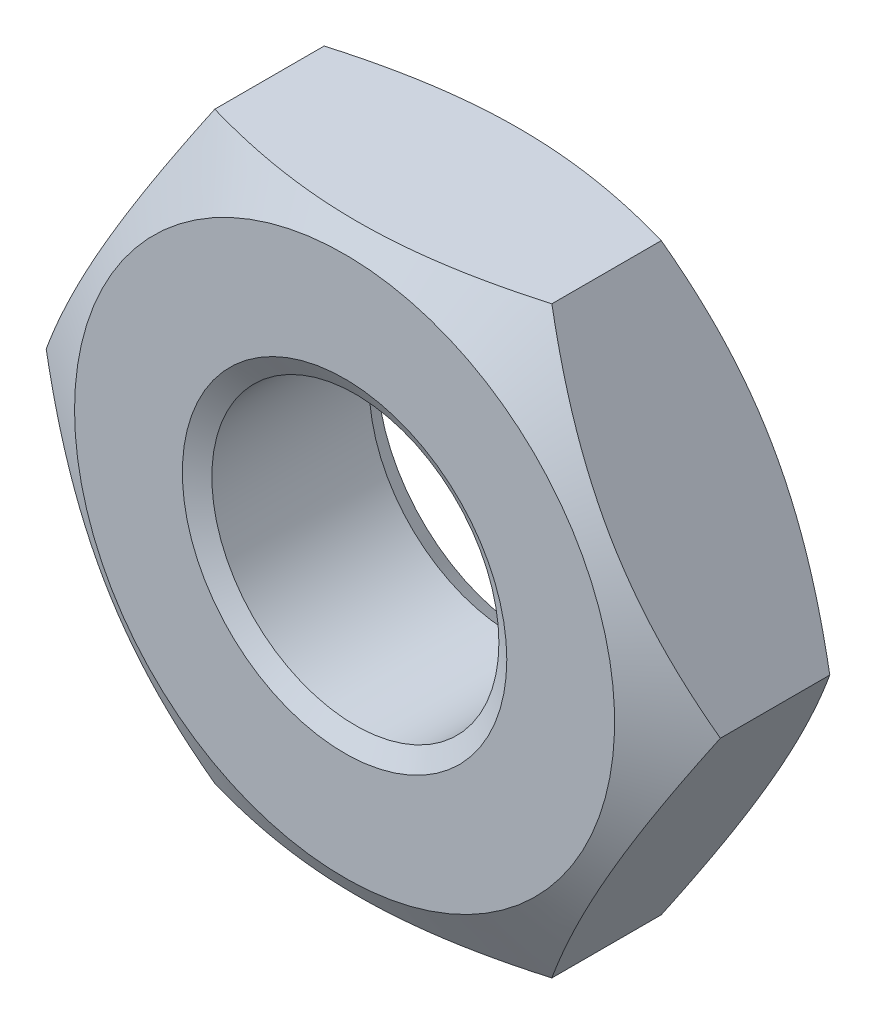
ISO-10303-21;
HEADER;
FILE_DESCRIPTION(('STEP AP214'),'2;1');
FILE_NAME('part.step','',(''),(''),'','','');
FILE_SCHEMA(('AUTOMOTIVE_DESIGN { 1 0 10303 214 1 1 1 1 }'));
ENDSEC;
DATA;
#1=APPLICATION_CONTEXT('core data for automotive mechanical design processes');
#2=APPLICATION_PROTOCOL_DEFINITION('international standard','automotive_design',2000,#1);
#3=PRODUCT_CONTEXT('',#1,'mechanical');
#4=PRODUCT('Part','Part','',(#3));
#5=PRODUCT_RELATED_PRODUCT_CATEGORY('part','',(#4));
#6=PRODUCT_DEFINITION_FORMATION('','',#4);
#7=PRODUCT_DEFINITION_CONTEXT('part definition',#1,'design');
#8=PRODUCT_DEFINITION('design','',#6,#7);
#9=PRODUCT_DEFINITION_SHAPE('','',#8);
#10=(LENGTH_UNIT() NAMED_UNIT(*) SI_UNIT(.MILLI.,.METRE.));
#11=(NAMED_UNIT(*) PLANE_ANGLE_UNIT() SI_UNIT($,.RADIAN.));
#12=(NAMED_UNIT(*) SI_UNIT($,.STERADIAN.) SOLID_ANGLE_UNIT());
#13=UNCERTAINTY_MEASURE_WITH_UNIT(LENGTH_MEASURE(1.E-05),#10,'distance_accuracy_value','');
#14=(GEOMETRIC_REPRESENTATION_CONTEXT(3) GLOBAL_UNCERTAINTY_ASSIGNED_CONTEXT((#13)) GLOBAL_UNIT_ASSIGNED_CONTEXT((#10,
#11,#12)) REPRESENTATION_CONTEXT('',''));
#15=CARTESIAN_POINT('',(0.,0.,0.));
#16=DIRECTION('',(0.,0.,1.));
#17=DIRECTION('',(1.,0.,0.));
#18=AXIS2_PLACEMENT_3D('',#15,#16,#17);
#19=CARTESIAN_POINT('',(2.88675134594813,-5.,0.));
#20=DIRECTION('',(0.,0.,1.));
#21=DIRECTION('',(1.,0.,0.));
#22=AXIS2_PLACEMENT_3D('',#19,#20,#21);
#23=PLANE('',#22);
#24=CARTESIAN_POINT('',(0.,0.,0.));
#25=DIRECTION('',(0.,0.,-1.));
#26=DIRECTION('',(-1.,0.,0.));
#27=AXIS2_PLACEMENT_3D('',#24,#25,#26);
#28=CIRCLE('',#27,4.6249999999759);
#29=CARTESIAN_POINT('',(-4.6249999999759,0.,0.));
#30=VERTEX_POINT('',#29);
#31=EDGE_CURVE('E110',#30,#30,#28,.T.);
#32=ORIENTED_EDGE('',*,*,#31,.F.);
#33=EDGE_LOOP('',(#32));
#34=FACE_BOUND('',#33,.T.);
#35=CARTESIAN_POINT('',(0.,0.,0.));
#36=DIRECTION('',(0.,0.,1.));
#37=DIRECTION('',(1.,0.,0.));
#38=AXIS2_PLACEMENT_3D('',#35,#36,#37);
#39=CIRCLE('',#38,2.77850000003355);
#40=CARTESIAN_POINT('',(2.77850000003355,0.,0.));
#41=VERTEX_POINT('',#40);
#42=EDGE_CURVE('E18',#41,#41,#39,.F.);
#43=ORIENTED_EDGE('',*,*,#42,.T.);
#44=EDGE_LOOP('',(#43));
#45=FACE_BOUND('',#44,.T.);
#46=ADVANCED_FACE('F15',(#34,#45),#23,.T.);
#47=CARTESIAN_POINT('',(0.,0.,0.));
#48=DIRECTION('',(0.,0.,1.));
#49=DIRECTION('',(1.,0.,0.));
#50=AXIS2_PLACEMENT_3D('',#47,#48,#49);
#51=CONICAL_SURFACE('',#50,2.77850000003355,1.04719755118795);
#52=ORIENTED_EDGE('',*,*,#42,.F.);
#53=EDGE_LOOP('',(#52));
#54=FACE_BOUND('',#53,.T.);
#55=CARTESIAN_POINT('',(0.,0.,-0.18475208614068));
#56=DIRECTION('',(0.,0.,1.));
#57=DIRECTION('',(1.,0.,0.));
#58=AXIS2_PLACEMENT_3D('',#55,#56,#57);
#59=CIRCLE('',#58,2.4585);
#60=CARTESIAN_POINT('',(2.4585,0.,-0.18475208614068));
#61=VERTEX_POINT('',#60);
#62=EDGE_CURVE('E86',#61,#61,#59,.F.);
#63=ORIENTED_EDGE('',*,*,#62,.T.);
#64=EDGE_LOOP('',(#63));
#65=FACE_BOUND('',#64,.T.);
#66=ADVANCED_FACE('F161',(#54,#65),#51,.F.);
#67=CARTESIAN_POINT('',(0.,0.,-0.667066868345501));
#68=DIRECTION('',(0.,0.,-1.));
#69=DIRECTION('',(-1.,0.,0.));
#70=AXIS2_PLACEMENT_3D('',#67,#68,#69);
#71=CONICAL_SURFACE('',#70,5.78039370799388,1.04719755119574);
#72=ORIENTED_EDGE('',*,*,#31,.T.);
#73=EDGE_LOOP('',(#72));
#74=FACE_BOUND('',#73,.T.);
#75=CARTESIAN_POINT('',(2.88675134594407,-5.,-0.663088338345368));
#76=CARTESIAN_POINT('',(2.63302758871641,-5.,-0.589831726217876));
#77=CARTESIAN_POINT('',(2.37713371755512,-5.,-0.523202296338955));
#78=CARTESIAN_POINT('',(1.86091527704772,-5.,-0.406902036159315));
#79=CARTESIAN_POINT('',(1.60058153832495,-5.,-0.357272342360833));
#80=CARTESIAN_POINT('',(1.08310061314158,-5.,-0.280032670020159));
#81=CARTESIAN_POINT('',(0.82603400015442,-5.,-0.251908165413179));
#82=CARTESIAN_POINT('',(0.439530175979334,-5.,-0.226691611482063));
#83=CARTESIAN_POINT('',(0.310607444274543,-5.,-0.221113063822284));
#84=CARTESIAN_POINT('',(0.0526429621055146,-5.,-0.215707475541625));
#85=CARTESIAN_POINT('',(-0.076398784557259,-5.,-0.215880257173388));
#86=CARTESIAN_POINT('',(-0.429906991090072,-5.,-0.224268077906376));
#87=CARTESIAN_POINT('',(-0.654256222667113,-5.,-0.238345328729833));
#88=CARTESIAN_POINT('',(-1.101465758272,-5.,-0.282977809300303));
#89=CARTESIAN_POINT('',(-1.32432449124187,-5.,-0.313548285040592));
#90=CARTESIAN_POINT('',(-1.77243449455366,-5.,-0.389964036094701));
#91=CARTESIAN_POINT('',(-1.99762923138921,-5.,-0.436133000545753));
#92=CARTESIAN_POINT('',(-2.44466090772317,-5.,-0.540917184882278));
#93=CARTESIAN_POINT('',(-2.66650356977503,-5.,-0.599507800192922));
#94=CARTESIAN_POINT('',(-2.88675134594406,-5.,-0.663088338345365));
#95=B_SPLINE_CURVE_WITH_KNOTS('',3,(#75,#76,#77,#78,#79,#80,#81,#82,#83,#84,#85,#86,#87,#88,#89,
#90,#91,#92,#93,#94),.UNSPECIFIED.,.F.,.F.,(4,2,2,2,2,2,2,2,2,4),(0.,0.79254002889212,
1.58698454256774,2.36176901538221,2.74878733562717,3.13579369491215,3.80946092924537,
4.48375195714968,5.17299552888332,5.86088640644705),.UNSPECIFIED.);
#96=CARTESIAN_POINT('',(2.88675134594915,-4.99999999999824,-0.663088338345954));
#97=VERTEX_POINT('',#96);
#98=CARTESIAN_POINT('',(-2.88675134594609,-5.,-0.663088338345953));
#99=VERTEX_POINT('',#98);
#100=EDGE_CURVE('E96',#97,#99,#95,.T.);
#101=ORIENTED_EDGE('',*,*,#100,.F.);
#102=CARTESIAN_POINT('',(5.77350269188933,-1.20031314410389E-11,-0.66308833834254));
#103=CARTESIAN_POINT('',(5.64664081327558,-0.219731219314651,-0.589831726215279));
#104=CARTESIAN_POINT('',(5.51869387769502,-0.441341812412933,-0.523202296336605));
#105=CARTESIAN_POINT('',(5.26058465744149,-0.888400095794025,-0.406902036157476));
#106=CARTESIAN_POINT('',(5.13041778808019,-1.11385572698997,-0.357272342359258));
#107=CARTESIAN_POINT('',(4.87167732548868,-1.56200735417234,-0.28003267001911));
#108=CARTESIAN_POINT('',(4.7431440189952,-1.78463357148388,-0.251908165412392));
#109=CARTESIAN_POINT('',(4.5498921069078,-2.1193557018791,-0.226691611481654));
#110=CARTESIAN_POINT('',(4.48543074105545,-2.23100606266065,-0.221113063821999));
#111=CARTESIAN_POINT('',(4.35644849997103,-2.45440985749295,-0.21570747554158));
#112=CARTESIAN_POINT('',(4.2919276266397,-2.56616328825154,-0.21588025717346));
#113=CARTESIAN_POINT('',(4.11517352337365,-2.8723103755546,-0.224268077906741));
#114=CARTESIAN_POINT('',(4.00299890758545,-3.06660250941929,-0.238345328730331));
#115=CARTESIAN_POINT('',(3.77939413978363,-3.45389732806668,-0.282977809300958));
#116=CARTESIAN_POINT('',(3.66796477329902,-3.64689865227324,-0.313548285041273));
#117=CARTESIAN_POINT('',(3.44390977164376,-4.03497329883007,-0.389964036095336));
#118=CARTESIAN_POINT('',(3.33131240322631,-4.22999766172765,-0.436133000546315));
#119=CARTESIAN_POINT('',(3.10779656505998,-4.61713844972808,-0.540917184882613));
#120=CARTESIAN_POINT('',(2.99687523403437,-4.80925983070761,-0.599507800193105));
#121=CARTESIAN_POINT('',(2.88675134595016,-4.99999999999648,-0.663088338345368));
#122=B_SPLINE_CURVE_WITH_KNOTS('',3,(#102,#103,#104,#105,#106,#107,#108,#109,#110,#111,#112,
#113,#114,#115,#116,#117,#118,#119,#120,#121),.UNSPECIFIED.,.F.,.F.,(4,2,2,2,2,2,2,2,2,4),(0.,
0.792540028891459,1.5869845425664,2.36176901538025,2.74878733562491,3.13579369490958,
3.80946092924094,4.4837519571434,5.17299552887507,5.86088640643685),.UNSPECIFIED.);
#123=CARTESIAN_POINT('',(5.77350269192004,0.,-0.663088338370699));
#124=VERTEX_POINT('',#123);
#125=EDGE_CURVE('E100',#124,#97,#122,.T.);
#126=ORIENTED_EDGE('',*,*,#125,.F.);
#127=CARTESIAN_POINT('',(2.88675134595015,4.99999999999649,-0.663088338345368));
#128=CARTESIAN_POINT('',(3.01361322456398,4.7802687806937,-0.589831726217878));
#129=CARTESIAN_POINT('',(3.14156016014463,4.55865818759528,-0.523202296338958));
#130=CARTESIAN_POINT('',(3.39966938039832,4.1115999042139,-0.406902036159318));
#131=CARTESIAN_POINT('',(3.52983624975971,3.8861442730178,-0.357272342360836));
#132=CARTESIAN_POINT('',(3.78857671235139,3.43799264583512,-0.280032670020161));
#133=CARTESIAN_POINT('',(3.91711001884497,3.21536642852342,-0.251908165413182));
#134=CARTESIAN_POINT('',(4.11036193093252,2.88064429812796,-0.226691611482065));
#135=CARTESIAN_POINT('',(4.17482329678492,2.76899393734632,-0.221113063822285));
#136=CARTESIAN_POINT('',(4.30380553786943,2.54559014251384,-0.215707475541626));
#137=CARTESIAN_POINT('',(4.36832641120082,2.43383671175516,-0.215880257173389));
#138=CARTESIAN_POINT('',(4.54508051446681,2.12768962445219,-0.224268077906357));
#139=CARTESIAN_POINT('',(4.65725513025492,1.93339749058767,-0.23834532872973));
#140=CARTESIAN_POINT('',(4.88085989805655,1.54610267194061,-0.282977809299915));
#141=CARTESIAN_POINT('',(4.99228926454107,1.3531013477342,-0.313548285040003));
#142=CARTESIAN_POINT('',(5.21634426619615,0.965026701177677,-0.38996403609361));
#143=CARTESIAN_POINT('',(5.32894163461351,0.770002338280255,-0.436133000544359));
#144=CARTESIAN_POINT('',(5.55245747277967,0.382861550280119,-0.54091718488021));
#145=CARTESIAN_POINT('',(5.6633788038052,0.190740169300734,-0.599507800190485));
#146=CARTESIAN_POINT('',(5.77350269188933,1.20040477902325E-11,-0.663088338342539));
#147=B_SPLINE_CURVE_WITH_KNOTS('',3,(#127,#128,#129,#130,#131,#132,#133,#134,#135,#136,#137,
#138,#139,#140,#141,#142,#143,#144,#145,#146),.UNSPECIFIED.,.F.,.F.,(4,2,2,2,2,2,2,2,2,4),(0.,
0.79254002889211,1.58698454256772,2.3617690153822,2.74878733562717,3.13579369491215,
3.80946092924288,4.48375195714471,5.17299552887573,5.86088640643686),.UNSPECIFIED.);
#148=CARTESIAN_POINT('',(2.88675134594609,5.,-0.663088338345953));
#149=VERTEX_POINT('',#148);
#150=EDGE_CURVE('E104',#149,#124,#147,.T.);
#151=ORIENTED_EDGE('',*,*,#150,.F.);
#152=CARTESIAN_POINT('',(-2.88675134594407,5.,-0.663088338345369));
#153=CARTESIAN_POINT('',(-2.63302758871641,5.,-0.589831726217877));
#154=CARTESIAN_POINT('',(-2.37713371755512,5.,-0.523202296338957));
#155=CARTESIAN_POINT('',(-1.86091527704772,5.,-0.406902036159317));
#156=CARTESIAN_POINT('',(-1.60058153832495,5.,-0.357272342360834));
#157=CARTESIAN_POINT('',(-1.08310061314157,5.,-0.280032670020159));
#158=CARTESIAN_POINT('',(-0.826034000154419,5.,-0.25190816541318));
#159=CARTESIAN_POINT('',(-0.439530175979333,5.,-0.226691611482064));
#160=CARTESIAN_POINT('',(-0.310607444274542,5.,-0.221113063822285));
#161=CARTESIAN_POINT('',(-0.0526429621055131,5.,-0.215707475541627));
#162=CARTESIAN_POINT('',(0.0763987845572606,5.,-0.21588025717339));
#163=CARTESIAN_POINT('',(0.429906991090074,5.,-0.224268077906377));
#164=CARTESIAN_POINT('',(0.654256222667115,5.,-0.238345328729835));
#165=CARTESIAN_POINT('',(1.101465758272,5.,-0.282977809300305));
#166=CARTESIAN_POINT('',(1.32432449124187,5.,-0.313548285040593));
#167=CARTESIAN_POINT('',(1.77243449455366,5.,-0.389964036094702));
#168=CARTESIAN_POINT('',(1.99762923138922,5.,-0.436133000545755));
#169=CARTESIAN_POINT('',(2.44466090772317,5.,-0.540917184882279));
#170=CARTESIAN_POINT('',(2.66650356977503,5.,-0.599507800192924));
#171=CARTESIAN_POINT('',(2.88675134594407,5.,-0.663088338345366));
#172=B_SPLINE_CURVE_WITH_KNOTS('',3,(#152,#153,#154,#155,#156,#157,#158,#159,#160,#161,#162,
#163,#164,#165,#166,#167,#168,#169,#170,#171),.UNSPECIFIED.,.F.,.F.,(4,2,2,2,2,2,2,2,2,4),(0.,
0.792540028892121,1.58698454256774,2.36176901538221,2.74878733562718,3.13579369491215,
3.80946092924537,4.48375195714968,5.17299552888332,5.86088640644705),.UNSPECIFIED.);
#173=CARTESIAN_POINT('',(-2.88675134594914,4.99999999999824,-0.663088338345955));
#174=VERTEX_POINT('',#173);
#175=EDGE_CURVE('E82',#174,#149,#172,.T.);
#176=ORIENTED_EDGE('',*,*,#175,.F.);
#177=CARTESIAN_POINT('',(-5.77350269188933,1.20039065509719E-11,-0.66308833834254));
#178=CARTESIAN_POINT('',(-5.64664081327558,0.219731219314651,-0.589831726215279));
#179=CARTESIAN_POINT('',(-5.51869387769502,0.441341812412933,-0.523202296336605));
#180=CARTESIAN_POINT('',(-5.26058465744149,0.888400095794026,-0.406902036157476));
#181=CARTESIAN_POINT('',(-5.13041778808019,1.11385572698997,-0.357272342359259));
#182=CARTESIAN_POINT('',(-4.87167732548868,1.56200735417234,-0.28003267001911));
#183=CARTESIAN_POINT('',(-4.7431440189952,1.78463357148389,-0.251908165412392));
#184=CARTESIAN_POINT('',(-4.54989210690779,2.1193557018791,-0.226691611481654));
#185=CARTESIAN_POINT('',(-4.48543074105545,2.23100606266065,-0.221113063821999));
#186=CARTESIAN_POINT('',(-4.35644849997103,2.45440985749295,-0.215707475541581));
#187=CARTESIAN_POINT('',(-4.2919276266397,2.56616328825154,-0.215880257173461));
#188=CARTESIAN_POINT('',(-4.11517352337365,2.87231037555461,-0.224268077906742));
#189=CARTESIAN_POINT('',(-4.00299890758545,3.0666025094193,-0.238345328730331));
#190=CARTESIAN_POINT('',(-3.77939413978363,3.45389732806668,-0.282977809300959));
#191=CARTESIAN_POINT('',(-3.66796477329902,3.64689865227325,-0.313548285041274));
#192=CARTESIAN_POINT('',(-3.44390977164376,4.03497329883008,-0.389964036095338));
#193=CARTESIAN_POINT('',(-3.33131240322631,4.22999766172765,-0.436133000546316));
#194=CARTESIAN_POINT('',(-3.10779656505998,4.61713844972809,-0.540917184882614));
#195=CARTESIAN_POINT('',(-2.99687523403436,4.80925983070761,-0.599507800193107));
#196=CARTESIAN_POINT('',(-2.88675134595016,4.99999999999649,-0.663088338345369));
#197=B_SPLINE_CURVE_WITH_KNOTS('',3,(#177,#178,#179,#180,#181,#182,#183,#184,#185,#186,#187,
#188,#189,#190,#191,#192,#193,#194,#195,#196),.UNSPECIFIED.,.F.,.F.,(4,2,2,2,2,2,2,2,2,4),(0.,
0.792540028891459,1.5869845425664,2.36176901538025,2.74878733562491,3.13579369490958,
3.80946092924095,4.4837519571434,5.17299552887508,5.86088640643686),.UNSPECIFIED.);
#198=CARTESIAN_POINT('',(-5.77350269190902,0.,-0.663088338370699));
#199=VERTEX_POINT('',#198);
#200=EDGE_CURVE('E79',#199,#174,#197,.T.);
#201=ORIENTED_EDGE('',*,*,#200,.F.);
#202=CARTESIAN_POINT('',(-2.88675134595015,-4.99999999999649,-0.663088338345369));
#203=CARTESIAN_POINT('',(-3.01361322456398,-4.7802687806937,-0.589831726217878));
#204=CARTESIAN_POINT('',(-3.14156016014463,-4.55865818759528,-0.523202296338958));
#205=CARTESIAN_POINT('',(-3.39966938039832,-4.1115999042139,-0.406902036159318));
#206=CARTESIAN_POINT('',(-3.52983624975971,-3.8861442730178,-0.357272342360836));
#207=CARTESIAN_POINT('',(-3.78857671235139,-3.43799264583512,-0.280032670020161));
#208=CARTESIAN_POINT('',(-3.91711001884497,-3.21536642852342,-0.251908165413181));
#209=CARTESIAN_POINT('',(-4.11036193093252,-2.88064429812796,-0.226691611482064));
#210=CARTESIAN_POINT('',(-4.17482329678492,-2.76899393734632,-0.221113063822285));
#211=CARTESIAN_POINT('',(-4.30380553786943,-2.54559014251384,-0.215707475541626));
#212=CARTESIAN_POINT('',(-4.36832641120082,-2.43383671175516,-0.215880257173389));
#213=CARTESIAN_POINT('',(-4.54508051446681,-2.12768962445219,-0.224268077906357));
#214=CARTESIAN_POINT('',(-4.65725513025492,-1.93339749058767,-0.23834532872973));
#215=CARTESIAN_POINT('',(-4.88085989805655,-1.54610267194061,-0.282977809299914));
#216=CARTESIAN_POINT('',(-4.99228926454107,-1.3531013477342,-0.313548285040002));
#217=CARTESIAN_POINT('',(-5.21634426619615,-0.965026701177676,-0.38996403609361));
#218=CARTESIAN_POINT('',(-5.32894163461351,-0.770002338280255,-0.436133000544358));
#219=CARTESIAN_POINT('',(-5.55245747277967,-0.382861550280118,-0.54091718488021));
#220=CARTESIAN_POINT('',(-5.6633788038052,-0.190740169300733,-0.599507800190485));
#221=CARTESIAN_POINT('',(-5.77350269188933,-1.20035172664307E-11,-0.663088338342539));
#222=B_SPLINE_CURVE_WITH_KNOTS('',3,(#202,#203,#204,#205,#206,#207,#208,#209,#210,#211,#212,
#213,#214,#215,#216,#217,#218,#219,#220,#221),.UNSPECIFIED.,.F.,.F.,(4,2,2,2,2,2,2,2,2,4),(0.,
0.79254002889211,1.58698454256772,2.3617690153822,2.74878733562717,3.13579369491215,
3.80946092924288,4.48375195714471,5.17299552887573,5.86088640643686),.UNSPECIFIED.);
#223=EDGE_CURVE('E65',#99,#199,#222,.T.);
#224=ORIENTED_EDGE('',*,*,#223,.F.);
#225=EDGE_LOOP('',(#101,#126,#151,#176,#201,#224));
#226=FACE_BOUND('',#225,.T.);
#227=ADVANCED_FACE('F80',(#74,#226),#71,.T.);
#228=CARTESIAN_POINT('',(0.,0.,-3.2));
#229=DIRECTION('',(0.,0.,1.));
#230=DIRECTION('',(1.,0.,0.));
#231=AXIS2_PLACEMENT_3D('',#228,#229,#230);
#232=CYLINDRICAL_SURFACE('',#231,2.4585);
#233=ORIENTED_EDGE('',*,*,#62,.F.);
#234=EDGE_LOOP('',(#233));
#235=FACE_BOUND('',#234,.T.);
#236=CARTESIAN_POINT('',(0.,0.,-2.88000000000466));
#237=DIRECTION('',(0.,0.,-1.));
#238=DIRECTION('',(-1.,0.,0.));
#239=AXIS2_PLACEMENT_3D('',#236,#237,#238);
#240=CIRCLE('',#239,2.45849999998882);
#241=CARTESIAN_POINT('',(-2.45849999998882,0.,-2.88000000000466));
#242=VERTEX_POINT('',#241);
#243=EDGE_CURVE('E91',#242,#242,#240,.T.);
#244=ORIENTED_EDGE('',*,*,#243,.T.);
#245=EDGE_LOOP('',(#244));
#246=FACE_BOUND('',#245,.T.);
#247=ADVANCED_FACE('F160',(#235,#246),#232,.F.);
#248=CARTESIAN_POINT('',(-2.88675134594813,5.,-3.2));
#249=DIRECTION('',(-0.866025403784439,0.5,0.));
#250=DIRECTION('',(-0.5,-0.866025403784439,0.));
#251=AXIS2_PLACEMENT_3D('',#248,#249,#250);
#252=PLANE('',#251);
#253=CARTESIAN_POINT('',(-5.77350269189215,7.12113710228619E-12,-2.53691166159153));
#254=CARTESIAN_POINT('',(-5.64664081329233,0.21973121928564,-2.61016827371077));
#255=CARTESIAN_POINT('',(-5.51869387772601,0.441341812359244,-2.67679770358298));
#256=CARTESIAN_POINT('',(-5.26058465750321,0.888400095687125,-2.79309796375256));
#257=CARTESIAN_POINT('',(-5.13041778815841,1.11385572685449,-2.84272765754795));
#258=CARTESIAN_POINT('',(-4.8716773255691,1.56200735403306,-2.91996732989757));
#259=CARTESIAN_POINT('',(-4.74314401906092,1.78463357137005,-2.94809183451165));
#260=CARTESIAN_POINT('',(-4.54989210695055,2.11935570180505,-2.97330838845001));
#261=CARTESIAN_POINT('',(-4.48543074108996,2.23100606260086,-2.97888693611162));
#262=CARTESIAN_POINT('',(-4.35644849998914,2.45440985746159,-2.98429252439399));
#263=CARTESIAN_POINT('',(-4.29192762664963,2.56616328823434,-2.98411974276214));
#264=CARTESIAN_POINT('',(-4.11517352703227,2.87231036921769,-2.97573192220356));
#265=CARTESIAN_POINT('',(-4.00299891489608,3.0666024967569,-2.96165467212706));
#266=CARTESIAN_POINT('',(-3.77939415433676,3.45389730285993,-2.91702219407878));
#267=CARTESIAN_POINT('',(-3.66796479144247,3.64689862084786,-2.88645172011618));
#268=CARTESIAN_POINT('',(-3.44390979705119,4.03497325482312,-2.81003597349457));
#269=CARTESIAN_POINT('',(-3.33131243230383,4.22999761136391,-2.76386701173045));
#270=CARTESIAN_POINT('',(-3.10779660134414,4.61713838688207,-2.65908283335216));
#271=CARTESIAN_POINT('',(-2.99687527385557,4.80925976173527,-2.60049222130928));
#272=CARTESIAN_POINT('',(-2.88675138925869,4.99999992498392,-2.53691168659452));
#273=B_SPLINE_CURVE_WITH_KNOTS('',3,(#253,#254,#255,#256,#257,#258,#259,#260,#261,#262,#263,
#264,#265,#266,#267,#268,#269,#270,#271,#272),.UNSPECIFIED.,.F.,.F.,(4,2,2,2,2,2,2,2,2,4),(0.,
0.792540028804203,1.58698454238065,2.36176901528401,2.74878733557851,3.13579369491108,
3.80946090730339,4.48375191318561,5.17299546175356,5.86088631632798),.UNSPECIFIED.);
#274=CARTESIAN_POINT('',(-5.77350269189215,0.,-2.53691166159153));
#275=VERTEX_POINT('',#274);
#276=CARTESIAN_POINT('',(-2.88675136760404,4.99999996249086,-2.5369116740922));
#277=VERTEX_POINT('',#276);
#278=EDGE_CURVE('E89',#275,#277,#273,.T.);
#279=ORIENTED_EDGE('',*,*,#278,.F.);
#280=DIRECTION('',(0.,0.,1.));
#281=VECTOR('',#280,1.);
#282=CARTESIAN_POINT('',(-5.77350269189626,0.,-3.2));
#283=LINE('',#282,#281);
#284=EDGE_CURVE('E70',#199,#275,#283,.F.);
#285=ORIENTED_EDGE('',*,*,#284,.F.);
#286=ORIENTED_EDGE('',*,*,#200,.T.);
#287=DIRECTION('',(0.,0.,1.));
#288=VECTOR('',#287,1.);
#289=CARTESIAN_POINT('',(-2.88675134594813,5.,-3.2));
#290=LINE('',#289,#288);
#291=EDGE_CURVE('E105',#277,#174,#290,.T.);
#292=ORIENTED_EDGE('',*,*,#291,.F.);
#293=EDGE_LOOP('',(#279,#285,#286,#292));
#294=FACE_BOUND('',#293,.T.);
#295=ADVANCED_FACE('F88',(#294),#252,.T.);
#296=CARTESIAN_POINT('',(2.88675134594813,5.,-3.2));
#297=DIRECTION('',(0.,1.,0.));
#298=DIRECTION('',(-1.,0.,0.));
#299=AXIS2_PLACEMENT_3D('',#296,#297,#298);
#300=PLANE('',#299);
#301=CARTESIAN_POINT('',(-2.88675137269846,4.99999996251521,-2.53691162932569));
#302=CARTESIAN_POINT('',(-2.63302761662786,4.99999998656136,-2.61016825747905));
#303=CARTESIAN_POINT('',(-2.3771337443472,4.99999999640385,-2.67679769466779));
#304=CARTESIAN_POINT('',(-1.86091529976752,5.00000000360479,-2.79309796155653));
#305=CARTESIAN_POINT('',(-1.60058155809026,5.00000000093319,-2.84272765475058));
#306=CARTESIAN_POINT('',(-1.08310062787336,4.9999999990899,-2.91996732759222));
#307=CARTESIAN_POINT('',(-0.826034012800502,4.99999999983325,-2.94809183328928));
#308=CARTESIAN_POINT('',(-0.43953018528029,5.0000000000833,-2.97330838805138));
#309=CARTESIAN_POINT('',(-0.310607452402469,5.00000000002272,-2.97888693585376));
#310=CARTESIAN_POINT('',(-0.0526429678815916,4.99999999997728,-2.98429252436232));
#311=CARTESIAN_POINT('',(0.0763987799600119,4.99999999999241,-2.9841197428154));
#312=CARTESIAN_POINT('',(0.42990698053665,5.00000000001321,-2.9757319223769));
#313=CARTESIAN_POINT('',(0.654256204993584,5.00000000000356,-2.96165467236363));
#314=CARTESIAN_POINT('',(1.10146572642382,4.99999999999644,-2.91702219442184));
#315=CARTESIAN_POINT('',(1.32432445233987,4.99999999999897,-2.88645172050672));
#316=CARTESIAN_POINT('',(1.77243444163707,5.00000000000105,-2.81003597391101));
#317=CARTESIAN_POINT('',(1.99762917151596,5.00000000000052,-2.7638670121076));
#318=CARTESIAN_POINT('',(2.44466083427479,4.99999999999948,-2.65908283358491));
#319=CARTESIAN_POINT('',(2.66650348970618,4.99999999999895,-2.60049222143247));
#320=CARTESIAN_POINT('',(2.88675125934678,5.,-2.53691168658881));
#321=B_SPLINE_CURVE_WITH_KNOTS('',3,(#301,#302,#303,#304,#305,#306,#307,#308,#309,#310,#311,
#312,#313,#314,#315,#316,#317,#318,#319,#320),.UNSPECIFIED.,.F.,.F.,(4,2,2,2,2,2,2,2,2,4),(0.,
0.792540037607905,1.58698455931626,2.36176903888394,2.74878736263668,3.13579372546036,
3.80946093838622,4.48375194462823,5.1729954943461,5.86088635031822),.UNSPECIFIED.);
#322=CARTESIAN_POINT('',(2.88675130264745,5.,-2.53691167408899));
#323=VERTEX_POINT('',#322);
#324=EDGE_CURVE('E198',#277,#323,#321,.T.);
#325=ORIENTED_EDGE('',*,*,#324,.F.);
#326=ORIENTED_EDGE('',*,*,#291,.T.);
#327=ORIENTED_EDGE('',*,*,#175,.T.);
#328=DIRECTION('',(0.,0.,1.));
#329=VECTOR('',#328,1.);
#330=CARTESIAN_POINT('',(2.88675134594812,5.,-3.2));
#331=LINE('',#330,#329);
#332=EDGE_CURVE('E101',#323,#149,#331,.T.);
#333=ORIENTED_EDGE('',*,*,#332,.F.);
#334=EDGE_LOOP('',(#325,#326,#327,#333));
#335=FACE_BOUND('',#334,.T.);
#336=ADVANCED_FACE('F190',(#335),#300,.T.);
#337=CARTESIAN_POINT('',(5.77350269189626,0.,-3.2));
#338=DIRECTION('',(0.866025403784438,0.5,0.));
#339=DIRECTION('',(-0.5,0.866025403784438,0.));
#340=AXIS2_PLACEMENT_3D('',#337,#338,#339);
#341=PLANE('',#340);
#342=CARTESIAN_POINT('',(2.88675130011159,5.00000000445261,-2.5369116293289));
#343=CARTESIAN_POINT('',(3.01361319897736,4.78026879814485,-2.61016825748462));
#344=CARTESIAN_POINT('',(3.14156014365236,4.5586582089714,-2.67679769467782));
#345=CARTESIAN_POINT('',(3.39966937220639,4.11159992560934,-2.79309796157544));
#346=CARTESIAN_POINT('',(3.52983624074855,3.88614429049118,-2.84272765477367));
#347=CARTESIAN_POINT('',(3.78857670426323,3.4379926580248,-2.91996732760782));
#348=CARTESIAN_POINT('',(3.9171100124284,3.21536643930388,-2.94809183329816));
#349=CARTESIAN_POINT('',(4.11036192638191,2.88064430617637,-2.97330838805387));
#350=CARTESIAN_POINT('',(4.17482329276011,2.76899394436291,-2.97888693585476));
#351=CARTESIAN_POINT('',(4.30380553496474,2.54559014749949,-2.98429252436227));
#352=CARTESIAN_POINT('',(4.36832640889044,2.43383671574168,-2.98411974281576));
#353=CARTESIAN_POINT('',(4.54508051284568,2.12768962728649,-2.97573192220378));
#354=CARTESIAN_POINT('',(4.65725512871807,1.93339749325669,-2.96165467144416));
#355=CARTESIAN_POINT('',(4.88085989667007,1.54610267433494,-2.91702219098132));
#356=CARTESIAN_POINT('',(4.99228926322091,1.35310135001873,-2.88645171528907));
#357=CARTESIAN_POINT('',(5.21634426513584,0.965026703016283,-2.81003596426192));
#358=CARTESIAN_POINT('',(5.32894163374519,0.770002339785287,-2.76386699977211));
#359=CARTESIAN_POINT('',(5.55245747233085,0.38286155105646,-2.65908281529217));
#360=CARTESIAN_POINT('',(5.66337880358338,0.190740169682858,-2.60049219987244));
#361=CARTESIAN_POINT('',(5.77350269189215,7.12013888323718E-12,-2.53691166159153));
#362=B_SPLINE_CURVE_WITH_KNOTS('',3,(#342,#343,#344,#345,#346,#347,#348,#349,#350,#351,#352,
#353,#354,#355,#356,#357,#358,#359,#360,#361),.UNSPECIFIED.,.F.,.F.,(4,2,2,2,2,2,2,2,2,4),(0.,
0.792540037694243,1.58698455950052,2.36176903897852,2.74878736268128,3.13579372545689,
3.80946096032324,4.48375198858698,5.17299556146986,5.86088644043051),.UNSPECIFIED.);
#363=CARTESIAN_POINT('',(5.77350269190058,3.55999998590813E-12,-2.53691166159248));
#364=VERTEX_POINT('',#363);
#365=EDGE_CURVE('E204',#323,#364,#362,.T.);
#366=ORIENTED_EDGE('',*,*,#365,.F.);
#367=ORIENTED_EDGE('',*,*,#332,.T.);
#368=ORIENTED_EDGE('',*,*,#150,.T.);
#369=DIRECTION('',(0.,0.,1.));
#370=VECTOR('',#369,1.);
#371=CARTESIAN_POINT('',(5.77350269189626,0.,-3.2));
#372=LINE('',#371,#370);
#373=EDGE_CURVE('E97',#364,#124,#372,.T.);
#374=ORIENTED_EDGE('',*,*,#373,.F.);
#375=EDGE_LOOP('',(#366,#367,#368,#374));
#376=FACE_BOUND('',#375,.T.);
#377=ADVANCED_FACE('F194',(#376),#341,.T.);
#378=CARTESIAN_POINT('',(2.88675134594813,-5.,-3.2));
#379=DIRECTION('',(0.866025403784439,-0.5,0.));
#380=DIRECTION('',(0.5,0.866025403784439,0.));
#381=AXIS2_PLACEMENT_3D('',#378,#379,#380);
#382=PLANE('',#381);
#383=CARTESIAN_POINT('',(5.77350269189215,-7.12026878422067E-12,-2.53691166159153));
#384=CARTESIAN_POINT('',(5.64664081329233,-0.219731219285634,-2.61016827371077));
#385=CARTESIAN_POINT('',(5.51869387772602,-0.441341812359231,-2.67679770358297));
#386=CARTESIAN_POINT('',(5.26058465750322,-0.888400095687101,-2.79309796375256));
#387=CARTESIAN_POINT('',(5.13041778815843,-1.11385572685446,-2.84272765754795));
#388=CARTESIAN_POINT('',(4.87167732556911,-1.56200735403303,-2.91996732989757));
#389=CARTESIAN_POINT('',(4.74314401906093,-1.78463357137002,-2.94809183451165));
#390=CARTESIAN_POINT('',(4.54989210695056,-2.11935570180503,-2.97330838845001));
#391=CARTESIAN_POINT('',(4.48543074108997,-2.23100606260085,-2.97888693611162));
#392=CARTESIAN_POINT('',(4.35644849998914,-2.45440985746158,-2.98429252439399));
#393=CARTESIAN_POINT('',(4.29192762664963,-2.56616328823433,-2.98411974276214));
#394=CARTESIAN_POINT('',(4.11517352703309,-2.87231036921627,-2.9757319222036));
#395=CARTESIAN_POINT('',(4.00299891489772,-3.06660249675406,-2.96165467212726));
#396=CARTESIAN_POINT('',(3.77939415434003,-3.45389730285427,-2.91702219407956));
#397=CARTESIAN_POINT('',(3.66796479144654,-3.64689862084081,-2.88645172011735));
#398=CARTESIAN_POINT('',(3.44390979705689,-4.03497325481324,-2.81003597349674));
#399=CARTESIAN_POINT('',(3.33131243231036,-4.2299976113526,-2.76386701173322));
#400=CARTESIAN_POINT('',(3.10779660135229,-4.61713838686796,-2.65908283335627));
#401=CARTESIAN_POINT('',(2.9968752738645,-4.80925976171979,-2.60049222131412));
#402=CARTESIAN_POINT('',(2.88675138926841,-4.99999992496708,-2.53691168660013));
#403=B_SPLINE_CURVE_WITH_KNOTS('',3,(#383,#384,#385,#386,#387,#388,#389,#390,#391,#392,#393,
#394,#395,#396,#397,#398,#399,#400,#401,#402),.UNSPECIFIED.,.F.,.F.,(4,2,2,2,2,2,2,2,2,4),(0.,
0.792540028804183,1.5869845423806,2.36176901528399,2.7487873355785,3.13579369491108,
3.80946090729846,4.48375191317574,5.17299546173849,5.86088631630775),.UNSPECIFIED.);
#404=CARTESIAN_POINT('',(2.88675136760827,-4.99999996248354,-2.53691167409465));
#405=VERTEX_POINT('',#404);
#406=EDGE_CURVE('E209',#364,#405,#403,.T.);
#407=ORIENTED_EDGE('',*,*,#406,.F.);
#408=ORIENTED_EDGE('',*,*,#373,.T.);
#409=ORIENTED_EDGE('',*,*,#125,.T.);
#410=DIRECTION('',(0.,0.,1.));
#411=VECTOR('',#410,1.);
#412=CARTESIAN_POINT('',(2.88675134594813,-5.,-3.2));
#413=LINE('',#412,#411);
#414=EDGE_CURVE('E75',#405,#97,#413,.T.);
#415=ORIENTED_EDGE('',*,*,#414,.F.);
#416=EDGE_LOOP('',(#407,#408,#409,#415));
#417=FACE_BOUND('',#416,.T.);
#418=ADVANCED_FACE('F214',(#417),#382,.T.);
#419=CARTESIAN_POINT('',(-2.88675134594813,-5.,-3.2));
#420=DIRECTION('',(0.,-1.,0.));
#421=DIRECTION('',(1.,0.,0.));
#422=AXIS2_PLACEMENT_3D('',#419,#420,#421);
#423=PLANE('',#422);
#424=CARTESIAN_POINT('',(2.88675137271445,-4.99999996250992,-2.53691162931761));
#425=CARTESIAN_POINT('',(2.6330276166438,-4.99999998655946,-2.61016825747352));
#426=CARTESIAN_POINT('',(2.37713374436279,-4.99999999640334,-2.6767976946636));
#427=CARTESIAN_POINT('',(1.8609152997821,-5.0000000036053,-2.79309796155392));
#428=CARTESIAN_POINT('',(1.60058155810421,-5.00000000093332,-2.84272765474822));
#429=CARTESIAN_POINT('',(1.08310062788615,-4.99999999908977,-2.91996732759059));
#430=CARTESIAN_POINT('',(0.826034012812774,-4.99999999983322,-2.94809183328812));
#431=CARTESIAN_POINT('',(0.439530185291738,-5.00000000008331,-2.97330838805081));
#432=CARTESIAN_POINT('',(0.310607452413632,-5.00000000002272,-2.97888693585337));
#433=CARTESIAN_POINT('',(0.0526429678921753,-4.99999999997728,-2.98429252436226));
#434=CARTESIAN_POINT('',(-0.0763987799497211,-4.99999999999241,-2.98411974281549));
#435=CARTESIAN_POINT('',(-0.429906980526627,-5.00000000001321,-2.9757319223774));
#436=CARTESIAN_POINT('',(-0.654256204983542,-5.00000000000356,-2.96165467236439));
#437=CARTESIAN_POINT('',(-1.10146572641375,-4.99999999999643,-2.9170221944231));
#438=CARTESIAN_POINT('',(-1.32432445232979,-4.99999999999897,-2.88645172050822));
#439=CARTESIAN_POINT('',(-1.77243444162702,-5.00000000000105,-2.81003597391296));
#440=CARTESIAN_POINT('',(-1.99762917150594,-5.00000000000052,-2.76386701210975));
#441=CARTESIAN_POINT('',(-2.44466083426486,-4.99999999999947,-2.65908283358744));
#442=CARTESIAN_POINT('',(-2.6665034896963,-4.99999999999895,-2.60049222143516));
#443=CARTESIAN_POINT('',(-2.88675125933695,-5.,-2.53691168659165));
#444=B_SPLINE_CURVE_WITH_KNOTS('',3,(#424,#425,#426,#427,#428,#429,#430,#431,#432,#433,#434,
#435,#436,#437,#438,#439,#440,#441,#442,#443),.UNSPECIFIED.,.F.,.F.,(4,2,2,2,2,2,2,2,2,4),(0.,
0.792540037609962,1.58698455932029,2.36176903888969,2.74878736264331,3.13579372546787,
3.80946093839362,4.4837519446355,5.17299549435335,5.86088635032549),.UNSPECIFIED.);
#445=CARTESIAN_POINT('',(-2.88675130264153,-5.,-2.5369116740907));
#446=VERTEX_POINT('',#445);
#447=EDGE_CURVE('E33',#405,#446,#444,.T.);
#448=ORIENTED_EDGE('',*,*,#447,.F.);
#449=ORIENTED_EDGE('',*,*,#414,.T.);
#450=ORIENTED_EDGE('',*,*,#100,.T.);
#451=DIRECTION('',(0.,0.,1.));
#452=VECTOR('',#451,1.);
#453=CARTESIAN_POINT('',(-2.88675134594812,-5.00000000000001,-3.2));
#454=LINE('',#453,#452);
#455=EDGE_CURVE('E72',#446,#99,#454,.T.);
#456=ORIENTED_EDGE('',*,*,#455,.F.);
#457=EDGE_LOOP('',(#448,#449,#450,#456));
#458=FACE_BOUND('',#457,.T.);
#459=ADVANCED_FACE('F135',(#458),#423,.T.);
#460=CARTESIAN_POINT('',(-5.77350269189626,0.,-3.2));
#461=DIRECTION('',(-0.866025403784438,-0.5,0.));
#462=DIRECTION('',(0.5,-0.866025403784438,0.));
#463=AXIS2_PLACEMENT_3D('',#460,#461,#462);
#464=PLANE('',#463);
#465=CARTESIAN_POINT('',(-2.88675130011795,-5.00000000441715,-2.53691162933068));
#466=CARTESIAN_POINT('',(-3.01361319898997,-4.78026879811424,-2.61016825749062));
#467=CARTESIAN_POINT('',(-3.14156014366758,-4.55865820894269,-2.67679769468514));
#468=CARTESIAN_POINT('',(-3.39966937222358,-4.11159992558192,-2.79309796158273));
#469=CARTESIAN_POINT('',(-3.52983624076508,-3.88614429046316,-2.84272765477961));
#470=CARTESIAN_POINT('',(-3.78857670427928,-3.43799265799641,-2.91996732761164));
#471=CARTESIAN_POINT('',(-3.91711001244461,-3.2153664392757,-2.94809183330119));
#472=CARTESIAN_POINT('',(-4.11036192639811,-2.88064430614836,-2.97330838805553));
#473=CARTESIAN_POINT('',(-4.17482329277628,-2.76899394433493,-2.97888693585592));
#474=CARTESIAN_POINT('',(-4.30380553498084,-2.5455901474716,-2.98429252436246));
#475=CARTESIAN_POINT('',(-4.36832640890651,-2.43383671571384,-2.98411974281547));
#476=CARTESIAN_POINT('',(-4.54508051286039,-2.12768962726101,-2.97573192220226));
#477=CARTESIAN_POINT('',(-4.65725512873144,-1.93339749323354,-2.96165467144208));
#478=CARTESIAN_POINT('',(-4.88085989668074,-1.54610267431645,-2.91702219097859));
#479=CARTESIAN_POINT('',(-4.99228926323023,-1.35310135000258,-2.88645171528624));
#480=CARTESIAN_POINT('',(-5.21634426514245,-0.965026703004834,-2.81003596425931));
#481=CARTESIAN_POINT('',(-5.32894163375044,-0.770002339776191,-2.7638669997698));
#482=CARTESIAN_POINT('',(-5.55245747233344,-0.382861551051977,-2.6590828152908));
#483=CARTESIAN_POINT('',(-5.66337880358466,-0.190740169680634,-2.60049219987169));
#484=CARTESIAN_POINT('',(-5.77350269189215,-7.11846117149179E-12,-2.53691166159153));
#485=B_SPLINE_CURVE_WITH_KNOTS('',3,(#465,#466,#467,#468,#469,#470,#471,#472,#473,#474,#475,
#476,#477,#478,#479,#480,#481,#482,#483,#484),.UNSPECIFIED.,.F.,.F.,(4,2,2,2,2,2,2,2,2,4),(0.,
0.79254003769424,1.58698455950022,2.36176903897772,2.74878736268027,3.13579372545569,
3.80946096031415,4.48375198856991,5.17299556144463,5.86088644039725),.UNSPECIFIED.);
#486=EDGE_CURVE('E114',#446,#275,#485,.T.);
#487=ORIENTED_EDGE('',*,*,#486,.F.);
#488=ORIENTED_EDGE('',*,*,#455,.T.);
#489=ORIENTED_EDGE('',*,*,#223,.T.);
#490=ORIENTED_EDGE('',*,*,#284,.T.);
#491=EDGE_LOOP('',(#487,#488,#489,#490));
#492=FACE_BOUND('',#491,.T.);
#493=ADVANCED_FACE('F68',(#492),#464,.T.);
#494=CARTESIAN_POINT('',(0.,0.,-3.20000000004939));
#495=DIRECTION('',(0.,0.,-1.));
#496=DIRECTION('',(0.,1.,0.));
#497=AXIS2_PLACEMENT_3D('',#494,#495,#496);
#498=CONICAL_SURFACE('',#497,2.64325208615901,0.523598775606942);
#499=CARTESIAN_POINT('',(0.,0.,-3.20000000004939));
#500=DIRECTION('',(0.,0.,-1.));
#501=DIRECTION('',(0.,1.,0.));
#502=AXIS2_PLACEMENT_3D('',#499,#500,#501);
#503=CIRCLE('',#502,2.64325208615901);
#504=CARTESIAN_POINT('',(0.,2.64325208615901,-3.20000000004939));
#505=VERTEX_POINT('',#504);
#506=EDGE_CURVE('E24',#505,#505,#503,.T.);
#507=ORIENTED_EDGE('',*,*,#506,.T.);
#508=EDGE_LOOP('',(#507));
#509=FACE_BOUND('',#508,.T.);
#510=ORIENTED_EDGE('',*,*,#243,.F.);
#511=EDGE_LOOP('',(#510));
#512=FACE_BOUND('',#511,.T.);
#513=ADVANCED_FACE('F134',(#509,#512),#498,.F.);
#514=CARTESIAN_POINT('',(0.,0.,-2.5329331315902));
#515=DIRECTION('',(0.,0.,1.));
#516=DIRECTION('',(1.,0.,0.));
#517=AXIS2_PLACEMENT_3D('',#514,#515,#516);
#518=CONICAL_SURFACE('',#517,5.78039370799388,1.04719755119574);
#519=CARTESIAN_POINT('',(0.,0.,-3.1999999999357));
#520=DIRECTION('',(0.,0.,1.));
#521=DIRECTION('',(1.,0.,0.));
#522=AXIS2_PLACEMENT_3D('',#519,#520,#521);
#523=CIRCLE('',#522,4.6249999999759);
#524=CARTESIAN_POINT('',(4.6249999999759,0.,-3.1999999999357));
#525=VERTEX_POINT('',#524);
#526=EDGE_CURVE('E10',#525,#525,#523,.T.);
#527=ORIENTED_EDGE('',*,*,#526,.T.);
#528=EDGE_LOOP('',(#527));
#529=FACE_BOUND('',#528,.T.);
#530=ORIENTED_EDGE('',*,*,#447,.T.);
#531=ORIENTED_EDGE('',*,*,#486,.T.);
#532=ORIENTED_EDGE('',*,*,#278,.T.);
#533=ORIENTED_EDGE('',*,*,#324,.T.);
#534=ORIENTED_EDGE('',*,*,#365,.T.);
#535=ORIENTED_EDGE('',*,*,#406,.T.);
#536=EDGE_LOOP('',(#530,#531,#532,#533,#534,#535));
#537=FACE_BOUND('',#536,.T.);
#538=ADVANCED_FACE('F128',(#529,#537),#518,.T.);
#539=CARTESIAN_POINT('',(2.88675134594813,-5.,-3.2));
#540=DIRECTION('',(0.,0.,1.));
#541=DIRECTION('',(1.,0.,0.));
#542=AXIS2_PLACEMENT_3D('',#539,#540,#541);
#543=PLANE('',#542);
#544=ORIENTED_EDGE('',*,*,#526,.F.);
#545=EDGE_LOOP('',(#544));
#546=FACE_BOUND('',#545,.T.);
#547=ORIENTED_EDGE('',*,*,#506,.F.);
#548=EDGE_LOOP('',(#547));
#549=FACE_BOUND('',#548,.T.);
#550=ADVANCED_FACE('F227',(#546,#549),#543,.F.);
#551=CLOSED_SHELL('',(#46,#66,#227,#247,#295,#336,#377,#418,#459,#493,#513,#538,#550));
#552=MANIFOLD_SOLID_BREP('B1',#551);
#553=ADVANCED_BREP_SHAPE_REPRESENTATION('',(#18,#552),#14);
#554=SHAPE_DEFINITION_REPRESENTATION(#9,#553);
ENDSEC;
END-ISO-10303-21;
